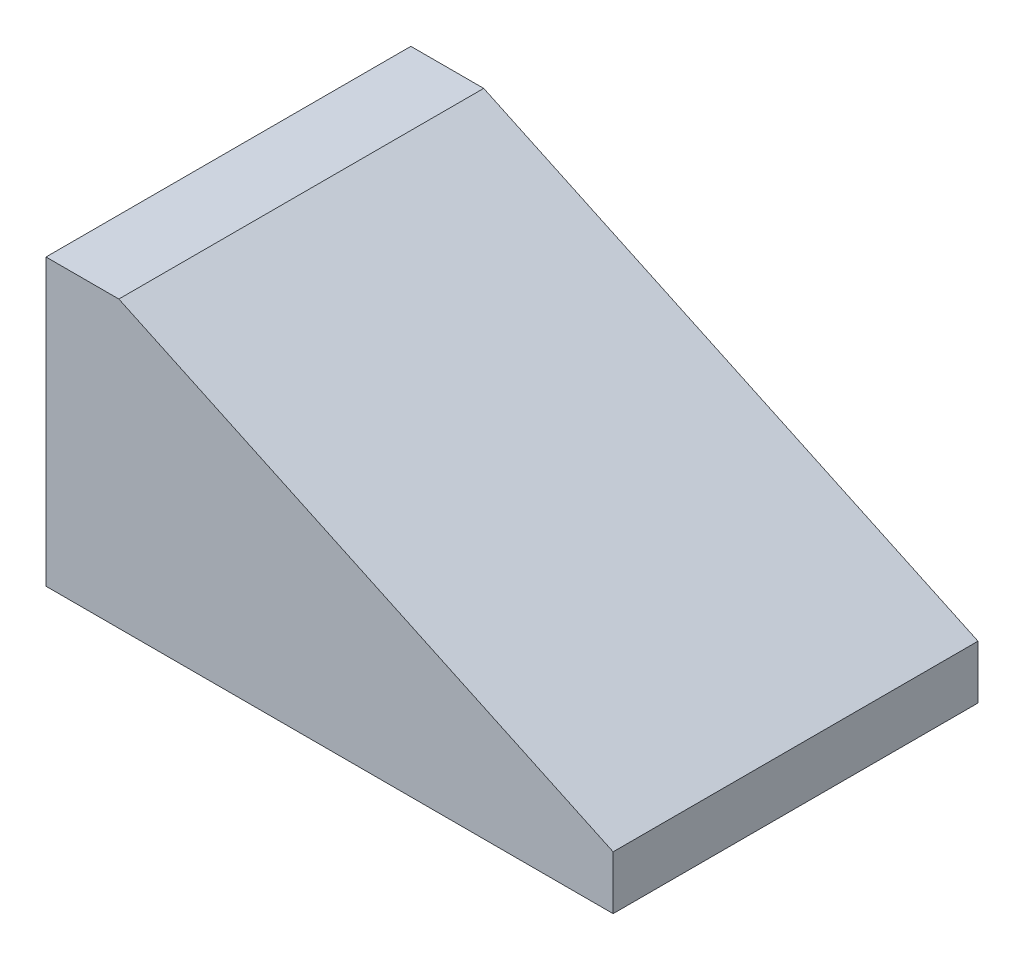
ISO-10303-21;
HEADER;
FILE_DESCRIPTION(('STEP AP214'),'2;1');
FILE_NAME('part.step','',(''),(''),'','','');
FILE_SCHEMA(('AUTOMOTIVE_DESIGN { 1 0 10303 214 1 1 1 1 }'));
ENDSEC;
DATA;
#1=APPLICATION_CONTEXT('core data for automotive mechanical design processes');
#2=APPLICATION_PROTOCOL_DEFINITION('international standard','automotive_design',2000,#1);
#3=PRODUCT_CONTEXT('',#1,'mechanical');
#4=PRODUCT('Part','Part','',(#3));
#5=PRODUCT_RELATED_PRODUCT_CATEGORY('part','',(#4));
#6=PRODUCT_DEFINITION_FORMATION('','',#4);
#7=PRODUCT_DEFINITION_CONTEXT('part definition',#1,'design');
#8=PRODUCT_DEFINITION('design','',#6,#7);
#9=PRODUCT_DEFINITION_SHAPE('','',#8);
#10=(LENGTH_UNIT() NAMED_UNIT(*) SI_UNIT(.MILLI.,.METRE.));
#11=(NAMED_UNIT(*) PLANE_ANGLE_UNIT() SI_UNIT($,.RADIAN.));
#12=(NAMED_UNIT(*) SI_UNIT($,.STERADIAN.) SOLID_ANGLE_UNIT());
#13=UNCERTAINTY_MEASURE_WITH_UNIT(LENGTH_MEASURE(1.E-05),#10,'distance_accuracy_value','');
#14=(GEOMETRIC_REPRESENTATION_CONTEXT(3) GLOBAL_UNCERTAINTY_ASSIGNED_CONTEXT((#13)) GLOBAL_UNIT_ASSIGNED_CONTEXT((#10,
#11,#12)) REPRESENTATION_CONTEXT('',''));
#15=CARTESIAN_POINT('',(0.,0.,0.));
#16=DIRECTION('',(0.,0.,1.));
#17=DIRECTION('',(1.,0.,0.));
#18=AXIS2_PLACEMENT_3D('',#15,#16,#17);
#19=CARTESIAN_POINT('',(11.2072737587867,43.8713054187192,-56.134));
#20=DIRECTION('',(0.,1.,0.));
#21=DIRECTION('',(0.,0.,1.));
#22=AXIS2_PLACEMENT_3D('',#19,#20,#21);
#23=PLANE('',#22);
#24=DIRECTION('',(-1.,0.,0.));
#25=VECTOR('',#24,1.);
#26=CARTESIAN_POINT('',(11.2072737587867,43.8713054187192,0.));
#27=LINE('',#26,#25);
#28=CARTESIAN_POINT('',(11.2072737587867,43.8713054187192,0.));
#29=VERTEX_POINT('',#28);
#30=CARTESIAN_POINT('',(0.,43.8713054187192,0.));
#31=VERTEX_POINT('',#30);
#32=EDGE_CURVE('E108',#29,#31,#27,.T.);
#33=ORIENTED_EDGE('',*,*,#32,.F.);
#34=DIRECTION('',(0.,0.,1.));
#35=VECTOR('',#34,1.);
#36=CARTESIAN_POINT('',(11.2072737587867,43.8713054187192,-56.134));
#37=LINE('',#36,#35);
#38=CARTESIAN_POINT('',(11.2072737587867,43.8713054187192,-56.134));
#39=VERTEX_POINT('',#38);
#40=EDGE_CURVE('E11',#39,#29,#37,.T.);
#41=ORIENTED_EDGE('',*,*,#40,.F.);
#42=DIRECTION('',(-1.,0.,0.));
#43=VECTOR('',#42,1.);
#44=CARTESIAN_POINT('',(11.2072737587867,43.8713054187192,-56.134));
#45=LINE('',#44,#43);
#46=CARTESIAN_POINT('',(0.,43.8713054187192,-56.134));
#47=VERTEX_POINT('',#46);
#48=EDGE_CURVE('E103',#39,#47,#45,.T.);
#49=ORIENTED_EDGE('',*,*,#48,.T.);
#50=DIRECTION('',(0.,0.,1.));
#51=VECTOR('',#50,1.);
#52=CARTESIAN_POINT('',(0.,43.8713054187192,-56.134));
#53=LINE('',#52,#51);
#54=EDGE_CURVE('E34',#47,#31,#53,.T.);
#55=ORIENTED_EDGE('',*,*,#54,.T.);
#56=EDGE_LOOP('',(#33,#41,#49,#55));
#57=FACE_BOUND('',#56,.T.);
#58=ADVANCED_FACE('F31',(#57),#23,.T.);
#59=CARTESIAN_POINT('',(87.2508698179,8.24248768472907,-56.134));
#60=DIRECTION('',(0.42427162986872,0.905534971212343,0.));
#61=DIRECTION('',(-0.905534971212343,0.42427162986872,0.));
#62=AXIS2_PLACEMENT_3D('',#59,#60,#61);
#63=PLANE('',#62);
#64=DIRECTION('',(-0.905534971212343,0.42427162986872,0.));
#65=VECTOR('',#64,1.);
#66=CARTESIAN_POINT('',(87.2508698179,8.24248768472907,0.));
#67=LINE('',#66,#65);
#68=CARTESIAN_POINT('',(87.2508698179,8.24248768472907,0.));
#69=VERTEX_POINT('',#68);
#70=EDGE_CURVE('E117',#69,#29,#67,.T.);
#71=ORIENTED_EDGE('',*,*,#70,.F.);
#72=DIRECTION('',(0.,0.,1.));
#73=VECTOR('',#72,1.);
#74=CARTESIAN_POINT('',(87.2508698179,8.24248768472907,-56.134));
#75=LINE('',#74,#73);
#76=CARTESIAN_POINT('',(87.2508698179,8.24248768472907,-56.134));
#77=VERTEX_POINT('',#76);
#78=EDGE_CURVE('E40',#77,#69,#75,.T.);
#79=ORIENTED_EDGE('',*,*,#78,.F.);
#80=DIRECTION('',(-0.905534971212343,0.42427162986872,0.));
#81=VECTOR('',#80,1.);
#82=CARTESIAN_POINT('',(87.2508698179,8.24248768472907,-56.134));
#83=LINE('',#82,#81);
#84=EDGE_CURVE('E98',#77,#39,#83,.T.);
#85=ORIENTED_EDGE('',*,*,#84,.T.);
#86=ORIENTED_EDGE('',*,*,#40,.T.);
#87=EDGE_LOOP('',(#71,#79,#85,#86));
#88=FACE_BOUND('',#87,.T.);
#89=ADVANCED_FACE('F123',(#88),#63,.T.);
#90=CARTESIAN_POINT('',(87.2508698179,0.,-56.134));
#91=DIRECTION('',(1.,0.,0.));
#92=DIRECTION('',(0.,0.,-1.));
#93=AXIS2_PLACEMENT_3D('',#90,#91,#92);
#94=PLANE('',#93);
#95=DIRECTION('',(0.,1.,0.));
#96=VECTOR('',#95,1.);
#97=CARTESIAN_POINT('',(87.2508698179,0.,0.));
#98=LINE('',#97,#96);
#99=CARTESIAN_POINT('',(87.2508698179,0.,0.));
#100=VERTEX_POINT('',#99);
#101=EDGE_CURVE('E87',#100,#69,#98,.T.);
#102=ORIENTED_EDGE('',*,*,#101,.F.);
#103=DIRECTION('',(0.,0.,1.));
#104=VECTOR('',#103,1.);
#105=CARTESIAN_POINT('',(87.2508698179,0.,-56.134));
#106=LINE('',#105,#104);
#107=CARTESIAN_POINT('',(87.2508698179,0.,-56.134));
#108=VERTEX_POINT('',#107);
#109=EDGE_CURVE('E82',#108,#100,#106,.T.);
#110=ORIENTED_EDGE('',*,*,#109,.F.);
#111=DIRECTION('',(0.,1.,0.));
#112=VECTOR('',#111,1.);
#113=CARTESIAN_POINT('',(87.2508698179,0.,-56.134));
#114=LINE('',#113,#112);
#115=EDGE_CURVE('E85',#108,#77,#114,.T.);
#116=ORIENTED_EDGE('',*,*,#115,.T.);
#117=ORIENTED_EDGE('',*,*,#78,.T.);
#118=EDGE_LOOP('',(#102,#110,#116,#117));
#119=FACE_BOUND('',#118,.T.);
#120=ADVANCED_FACE('F84',(#119),#94,.T.);
#121=CARTESIAN_POINT('',(0.,0.,-56.134));
#122=DIRECTION('',(0.,-1.,0.));
#123=DIRECTION('',(0.,0.,-1.));
#124=AXIS2_PLACEMENT_3D('',#121,#122,#123);
#125=PLANE('',#124);
#126=DIRECTION('',(1.,0.,0.));
#127=VECTOR('',#126,1.);
#128=CARTESIAN_POINT('',(0.,0.,0.));
#129=LINE('',#128,#127);
#130=CARTESIAN_POINT('',(0.,0.,0.));
#131=VERTEX_POINT('',#130);
#132=EDGE_CURVE('E114',#131,#100,#129,.T.);
#133=ORIENTED_EDGE('',*,*,#132,.F.);
#134=DIRECTION('',(0.,0.,1.));
#135=VECTOR('',#134,1.);
#136=CARTESIAN_POINT('',(0.,0.,-56.134));
#137=LINE('',#136,#135);
#138=CARTESIAN_POINT('',(0.,0.,-56.134));
#139=VERTEX_POINT('',#138);
#140=EDGE_CURVE('E92',#139,#131,#137,.T.);
#141=ORIENTED_EDGE('',*,*,#140,.F.);
#142=DIRECTION('',(1.,0.,0.));
#143=VECTOR('',#142,1.);
#144=CARTESIAN_POINT('',(0.,0.,-56.134));
#145=LINE('',#144,#143);
#146=EDGE_CURVE('E97',#139,#108,#145,.T.);
#147=ORIENTED_EDGE('',*,*,#146,.T.);
#148=ORIENTED_EDGE('',*,*,#109,.T.);
#149=EDGE_LOOP('',(#133,#141,#147,#148));
#150=FACE_BOUND('',#149,.T.);
#151=ADVANCED_FACE('F100',(#150),#125,.T.);
#152=CARTESIAN_POINT('',(0.,43.8713054187192,-56.134));
#153=DIRECTION('',(-1.,0.,0.));
#154=DIRECTION('',(0.,0.,1.));
#155=AXIS2_PLACEMENT_3D('',#152,#153,#154);
#156=PLANE('',#155);
#157=DIRECTION('',(0.,-1.,0.));
#158=VECTOR('',#157,1.);
#159=CARTESIAN_POINT('',(0.,43.8713054187192,0.));
#160=LINE('',#159,#158);
#161=EDGE_CURVE('E111',#31,#131,#160,.T.);
#162=ORIENTED_EDGE('',*,*,#161,.F.);
#163=ORIENTED_EDGE('',*,*,#54,.F.);
#164=DIRECTION('',(0.,-1.,0.));
#165=VECTOR('',#164,1.);
#166=CARTESIAN_POINT('',(0.,43.8713054187192,-56.134));
#167=LINE('',#166,#165);
#168=EDGE_CURVE('E101',#47,#139,#167,.T.);
#169=ORIENTED_EDGE('',*,*,#168,.T.);
#170=ORIENTED_EDGE('',*,*,#140,.T.);
#171=EDGE_LOOP('',(#162,#163,#169,#170));
#172=FACE_BOUND('',#171,.T.);
#173=ADVANCED_FACE('F120',(#172),#156,.T.);
#174=CARTESIAN_POINT('',(0.,43.8713054187192,-56.134));
#175=DIRECTION('',(0.,0.,1.));
#176=DIRECTION('',(1.,0.,0.));
#177=AXIS2_PLACEMENT_3D('',#174,#175,#176);
#178=PLANE('',#177);
#179=ORIENTED_EDGE('',*,*,#48,.F.);
#180=ORIENTED_EDGE('',*,*,#84,.F.);
#181=ORIENTED_EDGE('',*,*,#115,.F.);
#182=ORIENTED_EDGE('',*,*,#146,.F.);
#183=ORIENTED_EDGE('',*,*,#168,.F.);
#184=EDGE_LOOP('',(#179,#180,#181,#182,#183));
#185=FACE_BOUND('',#184,.T.);
#186=ADVANCED_FACE('F96',(#185),#178,.F.);
#187=CARTESIAN_POINT('',(0.,43.8713054187192,0.));
#188=DIRECTION('',(0.,0.,1.));
#189=DIRECTION('',(1.,0.,0.));
#190=AXIS2_PLACEMENT_3D('',#187,#188,#189);
#191=PLANE('',#190);
#192=ORIENTED_EDGE('',*,*,#32,.T.);
#193=ORIENTED_EDGE('',*,*,#161,.T.);
#194=ORIENTED_EDGE('',*,*,#132,.T.);
#195=ORIENTED_EDGE('',*,*,#101,.T.);
#196=ORIENTED_EDGE('',*,*,#70,.T.);
#197=EDGE_LOOP('',(#192,#193,#194,#195,#196));
#198=FACE_BOUND('',#197,.T.);
#199=ADVANCED_FACE('F122',(#198),#191,.T.);
#200=CLOSED_SHELL('',(#58,#89,#120,#151,#173,#186,#199));
#201=MANIFOLD_SOLID_BREP('B2',#200);
#202=ADVANCED_BREP_SHAPE_REPRESENTATION('',(#18,#201),#14);
#203=SHAPE_DEFINITION_REPRESENTATION(#9,#202);
ENDSEC;
END-ISO-10303-21;
